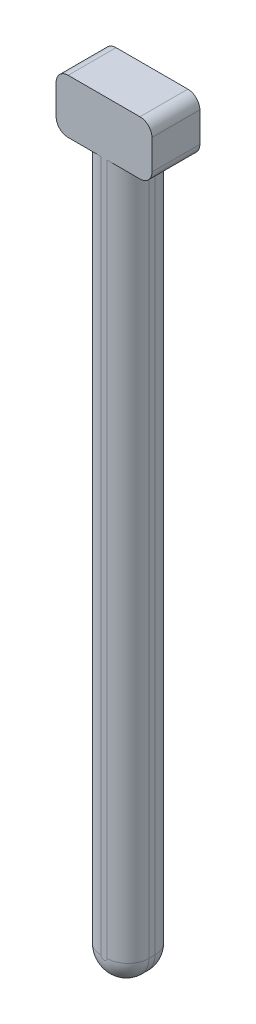
ISO-10303-21;
HEADER;
FILE_DESCRIPTION(('STEP AP214'),'2;1');
FILE_NAME('part.step','',(''),(''),'','','');
FILE_SCHEMA(('AUTOMOTIVE_DESIGN { 1 0 10303 214 1 1 1 1 }'));
ENDSEC;
DATA;
#1=APPLICATION_CONTEXT('core data for automotive mechanical design processes');
#2=APPLICATION_PROTOCOL_DEFINITION('international standard','automotive_design',2000,#1);
#3=PRODUCT_CONTEXT('',#1,'mechanical');
#4=PRODUCT('Part','Part','',(#3));
#5=PRODUCT_RELATED_PRODUCT_CATEGORY('part','',(#4));
#6=PRODUCT_DEFINITION_FORMATION('','',#4);
#7=PRODUCT_DEFINITION_CONTEXT('part definition',#1,'design');
#8=PRODUCT_DEFINITION('design','',#6,#7);
#9=PRODUCT_DEFINITION_SHAPE('','',#8);
#10=(LENGTH_UNIT() NAMED_UNIT(*) SI_UNIT(.MILLI.,.METRE.));
#11=(NAMED_UNIT(*) PLANE_ANGLE_UNIT() SI_UNIT($,.RADIAN.));
#12=(NAMED_UNIT(*) SI_UNIT($,.STERADIAN.) SOLID_ANGLE_UNIT());
#13=UNCERTAINTY_MEASURE_WITH_UNIT(LENGTH_MEASURE(1.E-05),#10,'distance_accuracy_value','');
#14=(GEOMETRIC_REPRESENTATION_CONTEXT(3) GLOBAL_UNCERTAINTY_ASSIGNED_CONTEXT((#13)) GLOBAL_UNIT_ASSIGNED_CONTEXT((#10,
#11,#12)) REPRESENTATION_CONTEXT('',''));
#15=CARTESIAN_POINT('',(0.,0.,0.));
#16=DIRECTION('',(0.,0.,1.));
#17=DIRECTION('',(1.,0.,0.));
#18=AXIS2_PLACEMENT_3D('',#15,#16,#17);
#19=CARTESIAN_POINT('',(0.,-2.25,4.));
#20=DIRECTION('',(0.,1.,0.));
#21=DIRECTION('',(0.,0.,1.));
#22=AXIS2_PLACEMENT_3D('',#19,#20,#21);
#23=PLANE('',#22);
#24=DIRECTION('',(1.,0.,0.));
#25=VECTOR('',#24,1.);
#26=CARTESIAN_POINT('',(0.,-2.25,4.));
#27=LINE('',#26,#25);
#28=CARTESIAN_POINT('',(-3.,-2.25,4.));
#29=VERTEX_POINT('',#28);
#30=CARTESIAN_POINT('',(-0.250000000000001,-2.25,4.));
#31=VERTEX_POINT('',#30);
#32=EDGE_CURVE('E242',#29,#31,#27,.T.);
#33=ORIENTED_EDGE('',*,*,#32,.F.);
#34=DIRECTION('',(0.,0.,-1.));
#35=VECTOR('',#34,1.);
#36=CARTESIAN_POINT('',(-3.,-2.25,0.));
#37=LINE('',#36,#35);
#38=CARTESIAN_POINT('',(-3.,-2.25,0.));
#39=VERTEX_POINT('',#38);
#40=EDGE_CURVE('E194',#29,#39,#37,.T.);
#41=ORIENTED_EDGE('',*,*,#40,.T.);
#42=DIRECTION('',(1.,0.,0.));
#43=VECTOR('',#42,1.);
#44=CARTESIAN_POINT('',(0.,-2.25,0.));
#45=LINE('',#44,#43);
#46=CARTESIAN_POINT('',(-0.250000000000001,-2.25,0.));
#47=VERTEX_POINT('',#46);
#48=EDGE_CURVE('E260',#39,#47,#45,.T.);
#49=ORIENTED_EDGE('',*,*,#48,.T.);
#50=CARTESIAN_POINT('',(-0.250000000000001,-2.25,1.75));
#51=DIRECTION('',(0.,1.,0.));
#52=DIRECTION('',(0.,0.,1.));
#53=AXIS2_PLACEMENT_3D('',#50,#51,#52);
#54=CIRCLE('',#53,1.75);
#55=CARTESIAN_POINT('',(-2.,-2.25,1.75));
#56=VERTEX_POINT('',#55);
#57=EDGE_CURVE('E288',#47,#56,#54,.T.);
#58=ORIENTED_EDGE('',*,*,#57,.T.);
#59=DIRECTION('',(0.,0.,-1.));
#60=VECTOR('',#59,1.);
#61=CARTESIAN_POINT('',(-2.,-2.25,4.));
#62=LINE('',#61,#60);
#63=CARTESIAN_POINT('',(-2.,-2.25,2.25));
#64=VERTEX_POINT('',#63);
#65=EDGE_CURVE('E172',#64,#56,#62,.T.);
#66=ORIENTED_EDGE('',*,*,#65,.F.);
#67=CARTESIAN_POINT('',(-0.250000000000001,-2.25,2.25));
#68=DIRECTION('',(0.,1.,0.));
#69=DIRECTION('',(0.,0.,1.));
#70=AXIS2_PLACEMENT_3D('',#67,#68,#69);
#71=CIRCLE('',#70,1.75);
#72=EDGE_CURVE('E181',#64,#31,#71,.T.);
#73=ORIENTED_EDGE('',*,*,#72,.T.);
#74=EDGE_LOOP('',(#33,#41,#49,#58,#66,#73));
#75=FACE_BOUND('',#74,.T.);
#76=ADVANCED_FACE('F35',(#75),#23,.F.);
#77=CARTESIAN_POINT('',(-2.,0.,4.));
#78=DIRECTION('',(1.,0.,0.));
#79=DIRECTION('',(0.,1.,0.));
#80=AXIS2_PLACEMENT_3D('',#77,#78,#79);
#81=PLANE('',#80);
#82=ORIENTED_EDGE('',*,*,#65,.T.);
#83=DIRECTION('',(0.,-1.,0.));
#84=VECTOR('',#83,1.);
#85=CARTESIAN_POINT('',(-2.,0.,1.75));
#86=LINE('',#85,#84);
#87=CARTESIAN_POINT('',(-1.99999999999999,-60.,1.75));
#88=VERTEX_POINT('',#87);
#89=EDGE_CURVE('E171',#56,#88,#86,.T.);
#90=ORIENTED_EDGE('',*,*,#89,.T.);
#91=DIRECTION('',(0.,0.,-1.));
#92=VECTOR('',#91,1.);
#93=CARTESIAN_POINT('',(-1.99999999999999,-60.,4.));
#94=LINE('',#93,#92);
#95=CARTESIAN_POINT('',(-1.99999999999999,-60.,2.25));
#96=VERTEX_POINT('',#95);
#97=EDGE_CURVE('E153',#96,#88,#94,.T.);
#98=ORIENTED_EDGE('',*,*,#97,.F.);
#99=DIRECTION('',(0.,-1.,0.));
#100=VECTOR('',#99,1.);
#101=CARTESIAN_POINT('',(-2.,-2.25,2.25));
#102=LINE('',#101,#100);
#103=EDGE_CURVE('E168',#96,#64,#102,.F.);
#104=ORIENTED_EDGE('',*,*,#103,.T.);
#105=EDGE_LOOP('',(#82,#90,#98,#104));
#106=FACE_BOUND('',#105,.T.);
#107=ADVANCED_FACE('F167',(#106),#81,.F.);
#108=CARTESIAN_POINT('',(0.,-60.,4.));
#109=DIRECTION('',(0.,0.,-1.));
#110=DIRECTION('',(-1.,0.,0.));
#111=AXIS2_PLACEMENT_3D('',#108,#109,#110);
#112=CYLINDRICAL_SURFACE('',#111,2.);
#113=ORIENTED_EDGE('',*,*,#97,.T.);
#114=CARTESIAN_POINT('',(0.,-60.,1.75));
#115=DIRECTION('',(0.,0.,1.));
#116=DIRECTION('',(1.,0.,0.));
#117=AXIS2_PLACEMENT_3D('',#114,#115,#116);
#118=CIRCLE('',#117,2.);
#119=CARTESIAN_POINT('',(2.00000000000001,-60.,1.75));
#120=VERTEX_POINT('',#119);
#121=EDGE_CURVE('E160',#88,#120,#118,.T.);
#122=ORIENTED_EDGE('',*,*,#121,.T.);
#123=DIRECTION('',(0.,0.,-1.));
#124=VECTOR('',#123,1.);
#125=CARTESIAN_POINT('',(2.00000000000001,-60.,4.));
#126=LINE('',#125,#124);
#127=CARTESIAN_POINT('',(2.00000000000001,-60.,2.25));
#128=VERTEX_POINT('',#127);
#129=EDGE_CURVE('E155',#128,#120,#126,.T.);
#130=ORIENTED_EDGE('',*,*,#129,.F.);
#131=CARTESIAN_POINT('',(0.,-60.,2.25));
#132=DIRECTION('',(0.,0.,1.));
#133=DIRECTION('',(1.,0.,0.));
#134=AXIS2_PLACEMENT_3D('',#131,#132,#133);
#135=CIRCLE('',#134,2.);
#136=EDGE_CURVE('E150',#128,#96,#135,.F.);
#137=ORIENTED_EDGE('',*,*,#136,.T.);
#138=EDGE_LOOP('',(#113,#122,#130,#137));
#139=FACE_BOUND('',#138,.T.);
#140=ADVANCED_FACE('F152',(#139),#112,.T.);
#141=CARTESIAN_POINT('',(2.,0.,4.));
#142=DIRECTION('',(1.,0.,0.));
#143=DIRECTION('',(0.,1.,0.));
#144=AXIS2_PLACEMENT_3D('',#141,#142,#143);
#145=PLANE('',#144);
#146=ORIENTED_EDGE('',*,*,#129,.T.);
#147=DIRECTION('',(0.,-1.,0.));
#148=VECTOR('',#147,1.);
#149=CARTESIAN_POINT('',(2.,-2.25,1.75));
#150=LINE('',#149,#148);
#151=CARTESIAN_POINT('',(2.,-2.25,1.75));
#152=VERTEX_POINT('',#151);
#153=EDGE_CURVE('E286',#120,#152,#150,.F.);
#154=ORIENTED_EDGE('',*,*,#153,.T.);
#155=DIRECTION('',(0.,0.,-1.));
#156=VECTOR('',#155,1.);
#157=CARTESIAN_POINT('',(2.,-2.25,4.));
#158=LINE('',#157,#156);
#159=CARTESIAN_POINT('',(2.,-2.25,2.25));
#160=VERTEX_POINT('',#159);
#161=EDGE_CURVE('E266',#160,#152,#158,.T.);
#162=ORIENTED_EDGE('',*,*,#161,.F.);
#163=DIRECTION('',(0.,-1.,0.));
#164=VECTOR('',#163,1.);
#165=CARTESIAN_POINT('',(2.,0.,2.25));
#166=LINE('',#165,#164);
#167=EDGE_CURVE('E284',#160,#128,#166,.T.);
#168=ORIENTED_EDGE('',*,*,#167,.T.);
#169=EDGE_LOOP('',(#146,#154,#162,#168));
#170=FACE_BOUND('',#169,.T.);
#171=ADVANCED_FACE('F327',(#170),#145,.T.);
#172=CARTESIAN_POINT('',(0.249999999999999,-2.25,0.));
#173=VERTEX_POINT('',#172);
#174=CARTESIAN_POINT('',(3.,-2.25,0.));
#175=VERTEX_POINT('',#174);
#176=EDGE_CURVE('E232',#173,#175,#45,.T.);
#177=ORIENTED_EDGE('',*,*,#176,.T.);
#178=DIRECTION('',(0.,0.,-1.));
#179=VECTOR('',#178,1.);
#180=CARTESIAN_POINT('',(3.,-2.25,4.));
#181=LINE('',#180,#179);
#182=CARTESIAN_POINT('',(3.,-2.25,4.));
#183=VERTEX_POINT('',#182);
#184=EDGE_CURVE('E223',#175,#183,#181,.F.);
#185=ORIENTED_EDGE('',*,*,#184,.T.);
#186=CARTESIAN_POINT('',(0.249999999999999,-2.25,4.));
#187=VERTEX_POINT('',#186);
#188=EDGE_CURVE('E229',#187,#183,#27,.T.);
#189=ORIENTED_EDGE('',*,*,#188,.F.);
#190=CARTESIAN_POINT('',(0.249999999999999,-2.25,2.25));
#191=DIRECTION('',(0.,1.,0.));
#192=DIRECTION('',(0.,0.,1.));
#193=AXIS2_PLACEMENT_3D('',#190,#191,#192);
#194=CIRCLE('',#193,1.75);
#195=EDGE_CURVE('E198',#187,#160,#194,.T.);
#196=ORIENTED_EDGE('',*,*,#195,.T.);
#197=ORIENTED_EDGE('',*,*,#161,.T.);
#198=CARTESIAN_POINT('',(0.249999999999999,-2.25,1.75));
#199=DIRECTION('',(0.,1.,0.));
#200=DIRECTION('',(0.,0.,1.));
#201=AXIS2_PLACEMENT_3D('',#198,#199,#200);
#202=CIRCLE('',#201,1.75);
#203=EDGE_CURVE('E291',#152,#173,#202,.T.);
#204=ORIENTED_EDGE('',*,*,#203,.T.);
#205=EDGE_LOOP('',(#177,#185,#189,#196,#197,#204));
#206=FACE_BOUND('',#205,.T.);
#207=ADVANCED_FACE('F228',(#206),#23,.F.);
#208=CARTESIAN_POINT('',(4.,0.,4.));
#209=DIRECTION('',(-1.,0.,0.));
#210=DIRECTION('',(0.,0.,1.));
#211=AXIS2_PLACEMENT_3D('',#208,#209,#210);
#212=PLANE('',#211);
#213=DIRECTION('',(0.,1.,0.));
#214=VECTOR('',#213,1.);
#215=CARTESIAN_POINT('',(4.,0.,4.));
#216=LINE('',#215,#214);
#217=CARTESIAN_POINT('',(4.,-1.25,4.));
#218=VERTEX_POINT('',#217);
#219=CARTESIAN_POINT('',(4.,1.25,4.));
#220=VERTEX_POINT('',#219);
#221=EDGE_CURVE('E241',#218,#220,#216,.T.);
#222=ORIENTED_EDGE('',*,*,#221,.F.);
#223=DIRECTION('',(0.,0.,-1.));
#224=VECTOR('',#223,1.);
#225=CARTESIAN_POINT('',(4.,-1.25,4.));
#226=LINE('',#225,#224);
#227=CARTESIAN_POINT('',(4.,-1.25,0.));
#228=VERTEX_POINT('',#227);
#229=EDGE_CURVE('E220',#218,#228,#226,.T.);
#230=ORIENTED_EDGE('',*,*,#229,.T.);
#231=DIRECTION('',(0.,1.,0.));
#232=VECTOR('',#231,1.);
#233=CARTESIAN_POINT('',(4.,0.,0.));
#234=LINE('',#233,#232);
#235=CARTESIAN_POINT('',(4.,1.25,0.));
#236=VERTEX_POINT('',#235);
#237=EDGE_CURVE('E250',#228,#236,#234,.T.);
#238=ORIENTED_EDGE('',*,*,#237,.T.);
#239=DIRECTION('',(0.,0.,-1.));
#240=VECTOR('',#239,1.);
#241=CARTESIAN_POINT('',(4.,1.25,4.));
#242=LINE('',#241,#240);
#243=EDGE_CURVE('E218',#236,#220,#242,.F.);
#244=ORIENTED_EDGE('',*,*,#243,.T.);
#245=EDGE_LOOP('',(#222,#230,#238,#244));
#246=FACE_BOUND('',#245,.T.);
#247=ADVANCED_FACE('F249',(#246),#212,.F.);
#248=CARTESIAN_POINT('',(0.,2.25,4.));
#249=DIRECTION('',(0.,1.,0.));
#250=DIRECTION('',(0.,0.,1.));
#251=AXIS2_PLACEMENT_3D('',#248,#249,#250);
#252=PLANE('',#251);
#253=DIRECTION('',(1.,0.,0.));
#254=VECTOR('',#253,1.);
#255=CARTESIAN_POINT('',(0.,2.25,4.));
#256=LINE('',#255,#254);
#257=CARTESIAN_POINT('',(-3.,2.25,4.));
#258=VERTEX_POINT('',#257);
#259=CARTESIAN_POINT('',(3.,2.25,4.));
#260=VERTEX_POINT('',#259);
#261=EDGE_CURVE('E368',#258,#260,#256,.T.);
#262=ORIENTED_EDGE('',*,*,#261,.T.);
#263=DIRECTION('',(0.,0.,-1.));
#264=VECTOR('',#263,1.);
#265=CARTESIAN_POINT('',(3.,2.25,0.));
#266=LINE('',#265,#264);
#267=CARTESIAN_POINT('',(3.,2.25,0.));
#268=VERTEX_POINT('',#267);
#269=EDGE_CURVE('E11',#260,#268,#266,.T.);
#270=ORIENTED_EDGE('',*,*,#269,.T.);
#271=DIRECTION('',(1.,0.,0.));
#272=VECTOR('',#271,1.);
#273=CARTESIAN_POINT('',(0.,2.25,0.));
#274=LINE('',#273,#272);
#275=CARTESIAN_POINT('',(-3.,2.25,0.));
#276=VERTEX_POINT('',#275);
#277=EDGE_CURVE('E256',#276,#268,#274,.T.);
#278=ORIENTED_EDGE('',*,*,#277,.F.);
#279=DIRECTION('',(0.,0.,-1.));
#280=VECTOR('',#279,1.);
#281=CARTESIAN_POINT('',(-3.,2.25,4.));
#282=LINE('',#281,#280);
#283=EDGE_CURVE('E43',#276,#258,#282,.F.);
#284=ORIENTED_EDGE('',*,*,#283,.T.);
#285=EDGE_LOOP('',(#262,#270,#278,#284));
#286=FACE_BOUND('',#285,.T.);
#287=ADVANCED_FACE('F332',(#286),#252,.T.);
#288=CARTESIAN_POINT('',(-4.,0.,4.));
#289=DIRECTION('',(-1.,0.,0.));
#290=DIRECTION('',(0.,0.,1.));
#291=AXIS2_PLACEMENT_3D('',#288,#289,#290);
#292=PLANE('',#291);
#293=DIRECTION('',(0.,1.,0.));
#294=VECTOR('',#293,1.);
#295=CARTESIAN_POINT('',(-4.,0.,0.));
#296=LINE('',#295,#294);
#297=CARTESIAN_POINT('',(-4.,-1.25,0.));
#298=VERTEX_POINT('',#297);
#299=CARTESIAN_POINT('',(-4.,1.25,0.));
#300=VERTEX_POINT('',#299);
#301=EDGE_CURVE('E258',#298,#300,#296,.T.);
#302=ORIENTED_EDGE('',*,*,#301,.F.);
#303=DIRECTION('',(0.,0.,-1.));
#304=VECTOR('',#303,1.);
#305=CARTESIAN_POINT('',(-4.,-1.25,4.));
#306=LINE('',#305,#304);
#307=CARTESIAN_POINT('',(-4.,-1.25,4.));
#308=VERTEX_POINT('',#307);
#309=EDGE_CURVE('E209',#298,#308,#306,.F.);
#310=ORIENTED_EDGE('',*,*,#309,.T.);
#311=DIRECTION('',(0.,1.,0.));
#312=VECTOR('',#311,1.);
#313=CARTESIAN_POINT('',(-4.,0.,4.));
#314=LINE('',#313,#312);
#315=CARTESIAN_POINT('',(-4.,1.25,4.));
#316=VERTEX_POINT('',#315);
#317=EDGE_CURVE('E269',#308,#316,#314,.T.);
#318=ORIENTED_EDGE('',*,*,#317,.T.);
#319=DIRECTION('',(0.,0.,-1.));
#320=VECTOR('',#319,1.);
#321=CARTESIAN_POINT('',(-4.,1.25,4.));
#322=LINE('',#321,#320);
#323=EDGE_CURVE('E206',#316,#300,#322,.T.);
#324=ORIENTED_EDGE('',*,*,#323,.T.);
#325=EDGE_LOOP('',(#302,#310,#318,#324));
#326=FACE_BOUND('',#325,.T.);
#327=ADVANCED_FACE('F374',(#326),#292,.T.);
#328=CARTESIAN_POINT('',(0.,0.,4.));
#329=DIRECTION('',(0.,0.,1.));
#330=DIRECTION('',(1.,0.,0.));
#331=AXIS2_PLACEMENT_3D('',#328,#329,#330);
#332=PLANE('',#331);
#333=ORIENTED_EDGE('',*,*,#317,.F.);
#334=CARTESIAN_POINT('',(-3.,-1.25,4.));
#335=DIRECTION('',(0.,0.,1.));
#336=DIRECTION('',(1.,0.,0.));
#337=AXIS2_PLACEMENT_3D('',#334,#335,#336);
#338=CIRCLE('',#337,1.);
#339=EDGE_CURVE('E216',#308,#29,#338,.T.);
#340=ORIENTED_EDGE('',*,*,#339,.T.);
#341=ORIENTED_EDGE('',*,*,#32,.T.);
#342=DIRECTION('',(0.,-1.,0.));
#343=VECTOR('',#342,1.);
#344=CARTESIAN_POINT('',(-0.249999999999992,-60.,4.));
#345=LINE('',#344,#343);
#346=CARTESIAN_POINT('',(-0.249999999999992,-60.,4.));
#347=VERTEX_POINT('',#346);
#348=EDGE_CURVE('E282',#31,#347,#345,.T.);
#349=ORIENTED_EDGE('',*,*,#348,.T.);
#350=CARTESIAN_POINT('',(0.,-60.,4.));
#351=DIRECTION('',(0.,0.,1.));
#352=DIRECTION('',(1.,0.,0.));
#353=AXIS2_PLACEMENT_3D('',#350,#351,#352);
#354=CIRCLE('',#353,0.25);
#355=CARTESIAN_POINT('',(0.250000000000008,-60.,4.));
#356=VERTEX_POINT('',#355);
#357=EDGE_CURVE('E184',#347,#356,#354,.T.);
#358=ORIENTED_EDGE('',*,*,#357,.T.);
#359=DIRECTION('',(0.,-1.,0.));
#360=VECTOR('',#359,1.);
#361=CARTESIAN_POINT('',(0.249999999999998,0.,4.));
#362=LINE('',#361,#360);
#363=EDGE_CURVE('E239',#356,#187,#362,.F.);
#364=ORIENTED_EDGE('',*,*,#363,.T.);
#365=ORIENTED_EDGE('',*,*,#188,.T.);
#366=CARTESIAN_POINT('',(3.,-1.25,4.));
#367=DIRECTION('',(0.,0.,1.));
#368=DIRECTION('',(1.,0.,0.));
#369=AXIS2_PLACEMENT_3D('',#366,#367,#368);
#370=CIRCLE('',#369,1.);
#371=EDGE_CURVE('E214',#183,#218,#370,.T.);
#372=ORIENTED_EDGE('',*,*,#371,.T.);
#373=ORIENTED_EDGE('',*,*,#221,.T.);
#374=CARTESIAN_POINT('',(3.,1.25,4.));
#375=DIRECTION('',(0.,0.,1.));
#376=DIRECTION('',(1.,0.,0.));
#377=AXIS2_PLACEMENT_3D('',#374,#375,#376);
#378=CIRCLE('',#377,1.);
#379=EDGE_CURVE('E50',#220,#260,#378,.T.);
#380=ORIENTED_EDGE('',*,*,#379,.T.);
#381=ORIENTED_EDGE('',*,*,#261,.F.);
#382=CARTESIAN_POINT('',(-3.,1.25,4.));
#383=DIRECTION('',(0.,0.,1.));
#384=DIRECTION('',(1.,0.,0.));
#385=AXIS2_PLACEMENT_3D('',#382,#383,#384);
#386=CIRCLE('',#385,1.);
#387=EDGE_CURVE('E211',#258,#316,#386,.T.);
#388=ORIENTED_EDGE('',*,*,#387,.T.);
#389=EDGE_LOOP('',(#333,#340,#341,#349,#358,#364,#365,#372,#373,#380,#381,#388));
#390=FACE_BOUND('',#389,.T.);
#391=ADVANCED_FACE('F236',(#390),#332,.T.);
#392=CARTESIAN_POINT('',(0.,0.,0.));
#393=DIRECTION('',(0.,0.,1.));
#394=DIRECTION('',(1.,0.,0.));
#395=AXIS2_PLACEMENT_3D('',#392,#393,#394);
#396=PLANE('',#395);
#397=ORIENTED_EDGE('',*,*,#48,.F.);
#398=CARTESIAN_POINT('',(-3.,-1.25,0.));
#399=DIRECTION('',(0.,0.,1.));
#400=DIRECTION('',(1.,0.,0.));
#401=AXIS2_PLACEMENT_3D('',#398,#399,#400);
#402=CIRCLE('',#401,1.);
#403=EDGE_CURVE('E204',#39,#298,#402,.F.);
#404=ORIENTED_EDGE('',*,*,#403,.T.);
#405=ORIENTED_EDGE('',*,*,#301,.T.);
#406=CARTESIAN_POINT('',(-3.,1.25,0.));
#407=DIRECTION('',(0.,0.,1.));
#408=DIRECTION('',(1.,0.,0.));
#409=AXIS2_PLACEMENT_3D('',#406,#407,#408);
#410=CIRCLE('',#409,1.);
#411=EDGE_CURVE('E197',#300,#276,#410,.F.);
#412=ORIENTED_EDGE('',*,*,#411,.T.);
#413=ORIENTED_EDGE('',*,*,#277,.T.);
#414=CARTESIAN_POINT('',(3.,1.25,0.));
#415=DIRECTION('',(0.,0.,1.));
#416=DIRECTION('',(1.,0.,0.));
#417=AXIS2_PLACEMENT_3D('',#414,#415,#416);
#418=CIRCLE('',#417,1.);
#419=EDGE_CURVE('E200',#268,#236,#418,.F.);
#420=ORIENTED_EDGE('',*,*,#419,.T.);
#421=ORIENTED_EDGE('',*,*,#237,.F.);
#422=CARTESIAN_POINT('',(3.,-1.25,0.));
#423=DIRECTION('',(0.,0.,1.));
#424=DIRECTION('',(1.,0.,0.));
#425=AXIS2_PLACEMENT_3D('',#422,#423,#424);
#426=CIRCLE('',#425,1.);
#427=EDGE_CURVE('E202',#228,#175,#426,.F.);
#428=ORIENTED_EDGE('',*,*,#427,.T.);
#429=ORIENTED_EDGE('',*,*,#176,.F.);
#430=DIRECTION('',(0.,-1.,0.));
#431=VECTOR('',#430,1.);
#432=CARTESIAN_POINT('',(0.250000000000008,-60.,0.));
#433=LINE('',#432,#431);
#434=CARTESIAN_POINT('',(0.250000000000008,-60.,0.));
#435=VERTEX_POINT('',#434);
#436=EDGE_CURVE('E273',#173,#435,#433,.T.);
#437=ORIENTED_EDGE('',*,*,#436,.T.);
#438=CARTESIAN_POINT('',(0.,-60.,0.));
#439=DIRECTION('',(0.,0.,1.));
#440=DIRECTION('',(1.,0.,0.));
#441=AXIS2_PLACEMENT_3D('',#438,#439,#440);
#442=CIRCLE('',#441,0.25);
#443=CARTESIAN_POINT('',(-0.249999999999992,-60.,0.));
#444=VERTEX_POINT('',#443);
#445=EDGE_CURVE('E275',#435,#444,#442,.F.);
#446=ORIENTED_EDGE('',*,*,#445,.T.);
#447=DIRECTION('',(0.,-1.,0.));
#448=VECTOR('',#447,1.);
#449=CARTESIAN_POINT('',(-0.250000000000002,0.,0.));
#450=LINE('',#449,#448);
#451=EDGE_CURVE('E161',#444,#47,#450,.F.);
#452=ORIENTED_EDGE('',*,*,#451,.T.);
#453=EDGE_LOOP('',(#397,#404,#405,#412,#413,#420,#421,#428,#429,#437,#446,#452));
#454=FACE_BOUND('',#453,.T.);
#455=ADVANCED_FACE('F254',(#454),#396,.F.);
#456=CARTESIAN_POINT('',(0.249999999999998,0.,1.75));
#457=DIRECTION('',(0.,1.,0.));
#458=DIRECTION('',(-1.,0.,0.));
#459=AXIS2_PLACEMENT_3D('',#456,#457,#458);
#460=CYLINDRICAL_SURFACE('',#459,1.75);
#461=ORIENTED_EDGE('',*,*,#203,.F.);
#462=ORIENTED_EDGE('',*,*,#153,.F.);
#463=CARTESIAN_POINT('',(0.250000000000008,-60.,1.75));
#464=DIRECTION('',(0.,-1.,0.));
#465=DIRECTION('',(0.,0.,-1.));
#466=AXIS2_PLACEMENT_3D('',#463,#464,#465);
#467=CIRCLE('',#466,1.75);
#468=EDGE_CURVE('E191',#435,#120,#467,.T.);
#469=ORIENTED_EDGE('',*,*,#468,.F.);
#470=ORIENTED_EDGE('',*,*,#436,.F.);
#471=EDGE_LOOP('',(#461,#462,#469,#470));
#472=FACE_BOUND('',#471,.T.);
#473=ADVANCED_FACE('F316',(#472),#460,.T.);
#474=CARTESIAN_POINT('',(0.,-60.,1.75));
#475=DIRECTION('',(0.,0.,1.));
#476=DIRECTION('',(1.,0.,0.));
#477=AXIS2_PLACEMENT_3D('',#474,#475,#476);
#478=DEGENERATE_TOROIDAL_SURFACE('',#477,0.25,1.75,.T.);
#479=ORIENTED_EDGE('',*,*,#468,.T.);
#480=ORIENTED_EDGE('',*,*,#121,.F.);
#481=CARTESIAN_POINT('',(-0.249999999999992,-60.,1.75));
#482=DIRECTION('',(0.,1.,0.));
#483=DIRECTION('',(0.,0.,1.));
#484=AXIS2_PLACEMENT_3D('',#481,#482,#483);
#485=CIRCLE('',#484,1.75);
#486=EDGE_CURVE('E188',#444,#88,#485,.T.);
#487=ORIENTED_EDGE('',*,*,#486,.F.);
#488=ORIENTED_EDGE('',*,*,#445,.F.);
#489=EDGE_LOOP('',(#479,#480,#487,#488));
#490=FACE_BOUND('',#489,.T.);
#491=ADVANCED_FACE('F308',(#490),#478,.T.);
#492=CARTESIAN_POINT('',(-0.250000000000002,0.,1.75));
#493=DIRECTION('',(0.,-1.,0.));
#494=DIRECTION('',(1.,0.,0.));
#495=AXIS2_PLACEMENT_3D('',#492,#493,#494);
#496=CYLINDRICAL_SURFACE('',#495,1.75);
#497=ORIENTED_EDGE('',*,*,#57,.F.);
#498=ORIENTED_EDGE('',*,*,#451,.F.);
#499=ORIENTED_EDGE('',*,*,#486,.T.);
#500=ORIENTED_EDGE('',*,*,#89,.F.);
#501=EDGE_LOOP('',(#497,#498,#499,#500));
#502=FACE_BOUND('',#501,.T.);
#503=ADVANCED_FACE('F305',(#502),#496,.T.);
#504=CARTESIAN_POINT('',(0.249999999999998,0.,2.25));
#505=DIRECTION('',(0.,-1.,0.));
#506=DIRECTION('',(1.,0.,0.));
#507=AXIS2_PLACEMENT_3D('',#504,#505,#506);
#508=CYLINDRICAL_SURFACE('',#507,1.75);
#509=ORIENTED_EDGE('',*,*,#195,.F.);
#510=ORIENTED_EDGE('',*,*,#363,.F.);
#511=CARTESIAN_POINT('',(0.250000000000008,-60.,2.25));
#512=DIRECTION('',(0.,-1.,0.));
#513=DIRECTION('',(0.,0.,-1.));
#514=AXIS2_PLACEMENT_3D('',#511,#512,#513);
#515=CIRCLE('',#514,1.75);
#516=EDGE_CURVE('E186',#128,#356,#515,.T.);
#517=ORIENTED_EDGE('',*,*,#516,.F.);
#518=ORIENTED_EDGE('',*,*,#167,.F.);
#519=EDGE_LOOP('',(#509,#510,#517,#518));
#520=FACE_BOUND('',#519,.T.);
#521=ADVANCED_FACE('F307',(#520),#508,.T.);
#522=CARTESIAN_POINT('',(0.,-60.,2.25));
#523=DIRECTION('',(0.,0.,1.));
#524=DIRECTION('',(1.,0.,0.));
#525=AXIS2_PLACEMENT_3D('',#522,#523,#524);
#526=DEGENERATE_TOROIDAL_SURFACE('',#525,0.25,1.75,.T.);
#527=ORIENTED_EDGE('',*,*,#516,.T.);
#528=ORIENTED_EDGE('',*,*,#357,.F.);
#529=CARTESIAN_POINT('',(-0.249999999999992,-60.,2.25));
#530=DIRECTION('',(0.,1.,0.));
#531=DIRECTION('',(0.,0.,1.));
#532=AXIS2_PLACEMENT_3D('',#529,#530,#531);
#533=CIRCLE('',#532,1.75);
#534=EDGE_CURVE('E178',#96,#347,#533,.T.);
#535=ORIENTED_EDGE('',*,*,#534,.F.);
#536=ORIENTED_EDGE('',*,*,#136,.F.);
#537=EDGE_LOOP('',(#527,#528,#535,#536));
#538=FACE_BOUND('',#537,.T.);
#539=ADVANCED_FACE('F183',(#538),#526,.T.);
#540=CARTESIAN_POINT('',(-0.250000000000002,0.,2.25));
#541=DIRECTION('',(0.,1.,0.));
#542=DIRECTION('',(-1.,0.,0.));
#543=AXIS2_PLACEMENT_3D('',#540,#541,#542);
#544=CYLINDRICAL_SURFACE('',#543,1.75);
#545=ORIENTED_EDGE('',*,*,#72,.F.);
#546=ORIENTED_EDGE('',*,*,#103,.F.);
#547=ORIENTED_EDGE('',*,*,#534,.T.);
#548=ORIENTED_EDGE('',*,*,#348,.F.);
#549=EDGE_LOOP('',(#545,#546,#547,#548));
#550=FACE_BOUND('',#549,.T.);
#551=ADVANCED_FACE('F176',(#550),#544,.T.);
#552=CARTESIAN_POINT('',(-3.,-1.25,4.));
#553=DIRECTION('',(0.,0.,1.));
#554=DIRECTION('',(1.,0.,0.));
#555=AXIS2_PLACEMENT_3D('',#552,#553,#554);
#556=CYLINDRICAL_SURFACE('',#555,1.);
#557=ORIENTED_EDGE('',*,*,#339,.F.);
#558=ORIENTED_EDGE('',*,*,#309,.F.);
#559=ORIENTED_EDGE('',*,*,#403,.F.);
#560=ORIENTED_EDGE('',*,*,#40,.F.);
#561=EDGE_LOOP('',(#557,#558,#559,#560));
#562=FACE_BOUND('',#561,.T.);
#563=ADVANCED_FACE('F353',(#562),#556,.T.);
#564=CARTESIAN_POINT('',(3.,-1.25,4.));
#565=DIRECTION('',(0.,0.,-1.));
#566=DIRECTION('',(-1.,0.,0.));
#567=AXIS2_PLACEMENT_3D('',#564,#565,#566);
#568=CYLINDRICAL_SURFACE('',#567,1.);
#569=ORIENTED_EDGE('',*,*,#371,.F.);
#570=ORIENTED_EDGE('',*,*,#184,.F.);
#571=ORIENTED_EDGE('',*,*,#427,.F.);
#572=ORIENTED_EDGE('',*,*,#229,.F.);
#573=EDGE_LOOP('',(#569,#570,#571,#572));
#574=FACE_BOUND('',#573,.T.);
#575=ADVANCED_FACE('F245',(#574),#568,.T.);
#576=CARTESIAN_POINT('',(3.,1.25,4.));
#577=DIRECTION('',(0.,0.,1.));
#578=DIRECTION('',(1.,0.,0.));
#579=AXIS2_PLACEMENT_3D('',#576,#577,#578);
#580=CYLINDRICAL_SURFACE('',#579,1.);
#581=ORIENTED_EDGE('',*,*,#379,.F.);
#582=ORIENTED_EDGE('',*,*,#243,.F.);
#583=ORIENTED_EDGE('',*,*,#419,.F.);
#584=ORIENTED_EDGE('',*,*,#269,.F.);
#585=EDGE_LOOP('',(#581,#582,#583,#584));
#586=FACE_BOUND('',#585,.T.);
#587=ADVANCED_FACE('F360',(#586),#580,.T.);
#588=CARTESIAN_POINT('',(-3.,1.25,4.));
#589=DIRECTION('',(0.,0.,-1.));
#590=DIRECTION('',(-1.,0.,0.));
#591=AXIS2_PLACEMENT_3D('',#588,#589,#590);
#592=CYLINDRICAL_SURFACE('',#591,1.);
#593=ORIENTED_EDGE('',*,*,#387,.F.);
#594=ORIENTED_EDGE('',*,*,#283,.F.);
#595=ORIENTED_EDGE('',*,*,#411,.F.);
#596=ORIENTED_EDGE('',*,*,#323,.F.);
#597=EDGE_LOOP('',(#593,#594,#595,#596));
#598=FACE_BOUND('',#597,.T.);
#599=ADVANCED_FACE('F37',(#598),#592,.T.);
#600=CLOSED_SHELL('',(#76,#107,#140,#171,#207,#247,#287,#327,#391,#455,#473,#491,#503,#521,#539,
#551,#563,#575,#587,#599));
#601=MANIFOLD_SOLID_BREP('B2',#600);
#602=ADVANCED_BREP_SHAPE_REPRESENTATION('',(#18,#601),#14);
#603=SHAPE_DEFINITION_REPRESENTATION(#9,#602);
ENDSEC;
END-ISO-10303-21;
